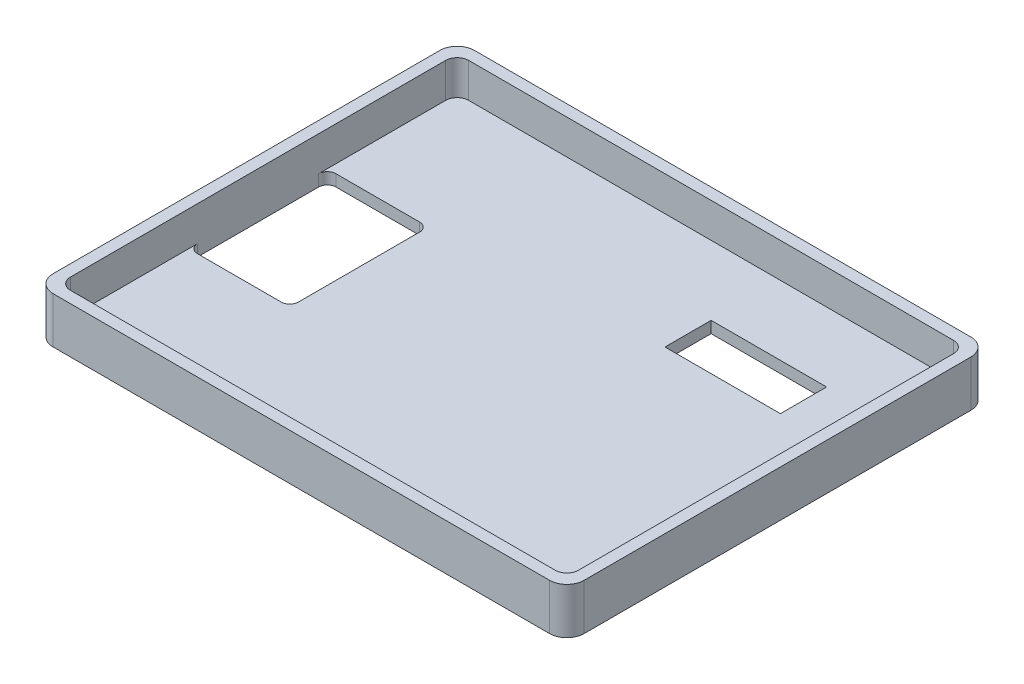
ISO-10303-21;
HEADER;
FILE_DESCRIPTION(('STEP AP214'),'2;1');
FILE_NAME('part.step','',(''),(''),'','','');
FILE_SCHEMA(('AUTOMOTIVE_DESIGN { 1 0 10303 214 1 1 1 1 }'));
ENDSEC;
DATA;
#1=APPLICATION_CONTEXT('core data for automotive mechanical design processes');
#2=APPLICATION_PROTOCOL_DEFINITION('international standard','automotive_design',2000,#1);
#3=PRODUCT_CONTEXT('',#1,'mechanical');
#4=PRODUCT('Part','Part','',(#3));
#5=PRODUCT_RELATED_PRODUCT_CATEGORY('part','',(#4));
#6=PRODUCT_DEFINITION_FORMATION('','',#4);
#7=PRODUCT_DEFINITION_CONTEXT('part definition',#1,'design');
#8=PRODUCT_DEFINITION('design','',#6,#7);
#9=PRODUCT_DEFINITION_SHAPE('','',#8);
#10=(LENGTH_UNIT() NAMED_UNIT(*) SI_UNIT(.MILLI.,.METRE.));
#11=(NAMED_UNIT(*) PLANE_ANGLE_UNIT() SI_UNIT($,.RADIAN.));
#12=(NAMED_UNIT(*) SI_UNIT($,.STERADIAN.) SOLID_ANGLE_UNIT());
#13=UNCERTAINTY_MEASURE_WITH_UNIT(LENGTH_MEASURE(1.E-05),#10,'distance_accuracy_value','');
#14=(GEOMETRIC_REPRESENTATION_CONTEXT(3) GLOBAL_UNCERTAINTY_ASSIGNED_CONTEXT((#13)) GLOBAL_UNIT_ASSIGNED_CONTEXT((#10,
#11,#12)) REPRESENTATION_CONTEXT('',''));
#15=CARTESIAN_POINT('',(0.,0.,0.));
#16=DIRECTION('',(0.,0.,1.));
#17=DIRECTION('',(1.,0.,0.));
#18=AXIS2_PLACEMENT_3D('',#15,#16,#17);
#19=CARTESIAN_POINT('',(0.,1.,-28.5));
#20=DIRECTION('',(0.,0.,-1.));
#21=DIRECTION('',(-1.,0.,0.));
#22=AXIS2_PLACEMENT_3D('',#19,#20,#21);
#23=PLANE('',#22);
#24=DIRECTION('',(1.,0.,0.));
#25=VECTOR('',#24,1.);
#26=CARTESIAN_POINT('',(0.,0.,-28.5));
#27=LINE('',#26,#25);
#28=CARTESIAN_POINT('',(28.,0.,-28.5));
#29=VERTEX_POINT('',#28);
#30=CARTESIAN_POINT('',(38.,0.,-28.5));
#31=VERTEX_POINT('',#30);
#32=EDGE_CURVE('E169',#29,#31,#27,.T.);
#33=ORIENTED_EDGE('',*,*,#32,.T.);
#34=DIRECTION('',(0.,-1.,0.));
#35=VECTOR('',#34,1.);
#36=CARTESIAN_POINT('',(38.,1.,-28.5));
#37=LINE('',#36,#35);
#38=CARTESIAN_POINT('',(38.,1.,-28.5));
#39=VERTEX_POINT('',#38);
#40=EDGE_CURVE('E11',#39,#31,#37,.T.);
#41=ORIENTED_EDGE('',*,*,#40,.F.);
#42=DIRECTION('',(1.,0.,0.));
#43=VECTOR('',#42,1.);
#44=CARTESIAN_POINT('',(0.,1.,-28.5));
#45=LINE('',#44,#43);
#46=CARTESIAN_POINT('',(28.,1.,-28.5));
#47=VERTEX_POINT('',#46);
#48=EDGE_CURVE('E133',#47,#39,#45,.T.);
#49=ORIENTED_EDGE('',*,*,#48,.F.);
#50=DIRECTION('',(0.,-1.,0.));
#51=VECTOR('',#50,1.);
#52=CARTESIAN_POINT('',(28.,1.,-28.5));
#53=LINE('',#52,#51);
#54=EDGE_CURVE('E54',#47,#29,#53,.T.);
#55=ORIENTED_EDGE('',*,*,#54,.T.);
#56=EDGE_LOOP('',(#33,#41,#49,#55));
#57=FACE_BOUND('',#56,.T.);
#58=ADVANCED_FACE('F35',(#57),#23,.F.);
#59=CARTESIAN_POINT('',(38.,1.,0.));
#60=DIRECTION('',(1.,0.,0.));
#61=DIRECTION('',(0.,0.,-1.));
#62=AXIS2_PLACEMENT_3D('',#59,#60,#61);
#63=PLANE('',#62);
#64=DIRECTION('',(0.,0.,1.));
#65=VECTOR('',#64,1.);
#66=CARTESIAN_POINT('',(38.,0.,0.));
#67=LINE('',#66,#65);
#68=CARTESIAN_POINT('',(38.,0.,-24.5));
#69=VERTEX_POINT('',#68);
#70=EDGE_CURVE('E139',#31,#69,#67,.T.);
#71=ORIENTED_EDGE('',*,*,#70,.T.);
#72=DIRECTION('',(0.,-1.,0.));
#73=VECTOR('',#72,1.);
#74=CARTESIAN_POINT('',(38.,1.,-24.5));
#75=LINE('',#74,#73);
#76=CARTESIAN_POINT('',(38.,1.,-24.5));
#77=VERTEX_POINT('',#76);
#78=EDGE_CURVE('E45',#77,#69,#75,.T.);
#79=ORIENTED_EDGE('',*,*,#78,.F.);
#80=DIRECTION('',(0.,0.,1.));
#81=VECTOR('',#80,1.);
#82=CARTESIAN_POINT('',(38.,1.,0.));
#83=LINE('',#82,#81);
#84=EDGE_CURVE('E127',#39,#77,#83,.T.);
#85=ORIENTED_EDGE('',*,*,#84,.F.);
#86=ORIENTED_EDGE('',*,*,#40,.T.);
#87=EDGE_LOOP('',(#71,#79,#85,#86));
#88=FACE_BOUND('',#87,.T.);
#89=ADVANCED_FACE('F138',(#88),#63,.F.);
#90=CARTESIAN_POINT('',(0.,1.,-24.5));
#91=DIRECTION('',(0.,0.,-1.));
#92=DIRECTION('',(-1.,0.,0.));
#93=AXIS2_PLACEMENT_3D('',#90,#91,#92);
#94=PLANE('',#93);
#95=DIRECTION('',(1.,0.,0.));
#96=VECTOR('',#95,1.);
#97=CARTESIAN_POINT('',(0.,0.,-24.5));
#98=LINE('',#97,#96);
#99=CARTESIAN_POINT('',(28.,0.,-24.5));
#100=VERTEX_POINT('',#99);
#101=EDGE_CURVE('E172',#100,#69,#98,.T.);
#102=ORIENTED_EDGE('',*,*,#101,.F.);
#103=DIRECTION('',(0.,-1.,0.));
#104=VECTOR('',#103,1.);
#105=CARTESIAN_POINT('',(28.,1.,-24.5));
#106=LINE('',#105,#104);
#107=CARTESIAN_POINT('',(28.,1.,-24.5));
#108=VERTEX_POINT('',#107);
#109=EDGE_CURVE('E90',#108,#100,#106,.T.);
#110=ORIENTED_EDGE('',*,*,#109,.F.);
#111=DIRECTION('',(1.,0.,0.));
#112=VECTOR('',#111,1.);
#113=CARTESIAN_POINT('',(0.,1.,-24.5));
#114=LINE('',#113,#112);
#115=EDGE_CURVE('E132',#108,#77,#114,.T.);
#116=ORIENTED_EDGE('',*,*,#115,.T.);
#117=ORIENTED_EDGE('',*,*,#78,.T.);
#118=EDGE_LOOP('',(#102,#110,#116,#117));
#119=FACE_BOUND('',#118,.T.);
#120=ADVANCED_FACE('F143',(#119),#94,.T.);
#121=CARTESIAN_POINT('',(0.75,1.,-22.5));
#122=DIRECTION('',(0.,-1.,0.));
#123=DIRECTION('',(0.,0.,-1.));
#124=AXIS2_PLACEMENT_3D('',#121,#122,#123);
#125=CYLINDRICAL_SURFACE('',#124,0.75);
#126=CARTESIAN_POINT('',(0.75,0.,-22.5));
#127=DIRECTION('',(0.,1.,0.));
#128=DIRECTION('',(0.,0.,1.));
#129=AXIS2_PLACEMENT_3D('',#126,#127,#128);
#130=CIRCLE('',#129,0.75);
#131=CARTESIAN_POINT('',(0.750000000000005,0.,-23.25));
#132=VERTEX_POINT('',#131);
#133=CARTESIAN_POINT('',(0.,0.,-22.5));
#134=VERTEX_POINT('',#133);
#135=EDGE_CURVE('E150',#132,#134,#130,.T.);
#136=ORIENTED_EDGE('',*,*,#135,.F.);
#137=DIRECTION('',(0.,-1.,0.));
#138=VECTOR('',#137,1.);
#139=CARTESIAN_POINT('',(0.750000000000005,1.,-23.25));
#140=LINE('',#139,#138);
#141=CARTESIAN_POINT('',(0.750000000000005,1.,-23.25));
#142=VERTEX_POINT('',#141);
#143=EDGE_CURVE('E102',#142,#132,#140,.T.);
#144=ORIENTED_EDGE('',*,*,#143,.F.);
#145=CARTESIAN_POINT('',(0.75,1.,-22.5));
#146=DIRECTION('',(0.,1.,0.));
#147=DIRECTION('',(0.,0.,1.));
#148=AXIS2_PLACEMENT_3D('',#145,#146,#147);
#149=CIRCLE('',#148,0.75);
#150=CARTESIAN_POINT('',(0.,1.,-22.5));
#151=VERTEX_POINT('',#150);
#152=EDGE_CURVE('E201',#142,#151,#149,.T.);
#153=ORIENTED_EDGE('',*,*,#152,.T.);
#154=DIRECTION('',(0.,-1.,0.));
#155=VECTOR('',#154,1.);
#156=CARTESIAN_POINT('',(0.,1.,-22.5));
#157=LINE('',#156,#155);
#158=EDGE_CURVE('E39',#151,#134,#157,.T.);
#159=ORIENTED_EDGE('',*,*,#158,.T.);
#160=EDGE_LOOP('',(#136,#144,#153,#159));
#161=FACE_BOUND('',#160,.T.);
#162=ADVANCED_FACE('F37',(#161),#125,.F.);
#163=CARTESIAN_POINT('',(0.,1.,-23.25));
#164=DIRECTION('',(0.,0.,1.));
#165=DIRECTION('',(1.,0.,0.));
#166=AXIS2_PLACEMENT_3D('',#163,#164,#165);
#167=PLANE('',#166);
#168=DIRECTION('',(-1.,0.,0.));
#169=VECTOR('',#168,1.);
#170=CARTESIAN_POINT('',(0.,0.,-23.25));
#171=LINE('',#170,#169);
#172=CARTESIAN_POINT('',(8.,0.,-23.25));
#173=VERTEX_POINT('',#172);
#174=EDGE_CURVE('E153',#173,#132,#171,.T.);
#175=ORIENTED_EDGE('',*,*,#174,.F.);
#176=DIRECTION('',(0.,-1.,0.));
#177=VECTOR('',#176,1.);
#178=CARTESIAN_POINT('',(8.,1.,-23.25));
#179=LINE('',#178,#177);
#180=CARTESIAN_POINT('',(8.,1.,-23.25));
#181=VERTEX_POINT('',#180);
#182=EDGE_CURVE('E193',#181,#173,#179,.T.);
#183=ORIENTED_EDGE('',*,*,#182,.F.);
#184=DIRECTION('',(-1.,0.,0.));
#185=VECTOR('',#184,1.);
#186=CARTESIAN_POINT('',(0.,1.,-23.25));
#187=LINE('',#186,#185);
#188=EDGE_CURVE('E218',#181,#142,#187,.T.);
#189=ORIENTED_EDGE('',*,*,#188,.T.);
#190=ORIENTED_EDGE('',*,*,#143,.T.);
#191=EDGE_LOOP('',(#175,#183,#189,#190));
#192=FACE_BOUND('',#191,.T.);
#193=ADVANCED_FACE('F215',(#192),#167,.T.);
#194=CARTESIAN_POINT('',(8.,1.,-22.5));
#195=DIRECTION('',(0.,-1.,0.));
#196=DIRECTION('',(0.,0.,-1.));
#197=AXIS2_PLACEMENT_3D('',#194,#195,#196);
#198=CYLINDRICAL_SURFACE('',#197,0.75);
#199=CARTESIAN_POINT('',(8.,0.,-22.5));
#200=DIRECTION('',(0.,1.,0.));
#201=DIRECTION('',(0.,0.,1.));
#202=AXIS2_PLACEMENT_3D('',#199,#200,#201);
#203=CIRCLE('',#202,0.75);
#204=CARTESIAN_POINT('',(8.75,0.,-22.5));
#205=VERTEX_POINT('',#204);
#206=EDGE_CURVE('E157',#173,#205,#203,.F.);
#207=ORIENTED_EDGE('',*,*,#206,.T.);
#208=DIRECTION('',(0.,-1.,0.));
#209=VECTOR('',#208,1.);
#210=CARTESIAN_POINT('',(8.75,1.,-22.5));
#211=LINE('',#210,#209);
#212=CARTESIAN_POINT('',(8.75,1.,-22.5));
#213=VERTEX_POINT('',#212);
#214=EDGE_CURVE('E190',#213,#205,#211,.T.);
#215=ORIENTED_EDGE('',*,*,#214,.F.);
#216=CARTESIAN_POINT('',(8.,1.,-22.5));
#217=DIRECTION('',(0.,1.,0.));
#218=DIRECTION('',(0.,0.,1.));
#219=AXIS2_PLACEMENT_3D('',#216,#217,#218);
#220=CIRCLE('',#219,0.75);
#221=EDGE_CURVE('E221',#181,#213,#220,.F.);
#222=ORIENTED_EDGE('',*,*,#221,.F.);
#223=ORIENTED_EDGE('',*,*,#182,.T.);
#224=EDGE_LOOP('',(#207,#215,#222,#223));
#225=FACE_BOUND('',#224,.T.);
#226=ADVANCED_FACE('F222',(#225),#198,.F.);
#227=CARTESIAN_POINT('',(8.75,1.,0.));
#228=DIRECTION('',(1.,0.,0.));
#229=DIRECTION('',(0.,0.,-1.));
#230=AXIS2_PLACEMENT_3D('',#227,#228,#229);
#231=PLANE('',#230);
#232=DIRECTION('',(0.,0.,1.));
#233=VECTOR('',#232,1.);
#234=CARTESIAN_POINT('',(8.75,0.,0.));
#235=LINE('',#234,#233);
#236=CARTESIAN_POINT('',(8.75,0.,-12.));
#237=VERTEX_POINT('',#236);
#238=EDGE_CURVE('E159',#205,#237,#235,.T.);
#239=ORIENTED_EDGE('',*,*,#238,.T.);
#240=DIRECTION('',(0.,-1.,0.));
#241=VECTOR('',#240,1.);
#242=CARTESIAN_POINT('',(8.75,1.,-12.));
#243=LINE('',#242,#241);
#244=CARTESIAN_POINT('',(8.75,1.,-12.));
#245=VERTEX_POINT('',#244);
#246=EDGE_CURVE('E187',#245,#237,#243,.T.);
#247=ORIENTED_EDGE('',*,*,#246,.F.);
#248=DIRECTION('',(0.,0.,1.));
#249=VECTOR('',#248,1.);
#250=CARTESIAN_POINT('',(8.75,1.,0.));
#251=LINE('',#250,#249);
#252=EDGE_CURVE('E225',#213,#245,#251,.T.);
#253=ORIENTED_EDGE('',*,*,#252,.F.);
#254=ORIENTED_EDGE('',*,*,#214,.T.);
#255=EDGE_LOOP('',(#239,#247,#253,#254));
#256=FACE_BOUND('',#255,.T.);
#257=ADVANCED_FACE('F444',(#256),#231,.F.);
#258=CARTESIAN_POINT('',(8.,1.,-12.));
#259=DIRECTION('',(0.,-1.,0.));
#260=DIRECTION('',(0.,0.,-1.));
#261=AXIS2_PLACEMENT_3D('',#258,#259,#260);
#262=CYLINDRICAL_SURFACE('',#261,0.749999999999999);
#263=CARTESIAN_POINT('',(8.,0.,-12.));
#264=DIRECTION('',(0.,1.,0.));
#265=DIRECTION('',(0.,0.,1.));
#266=AXIS2_PLACEMENT_3D('',#263,#264,#265);
#267=CIRCLE('',#266,0.749999999999999);
#268=CARTESIAN_POINT('',(8.,0.,-11.25));
#269=VERTEX_POINT('',#268);
#270=EDGE_CURVE('E161',#237,#269,#267,.F.);
#271=ORIENTED_EDGE('',*,*,#270,.T.);
#272=DIRECTION('',(0.,-1.,0.));
#273=VECTOR('',#272,1.);
#274=CARTESIAN_POINT('',(8.,1.,-11.25));
#275=LINE('',#274,#273);
#276=CARTESIAN_POINT('',(8.,1.,-11.25));
#277=VERTEX_POINT('',#276);
#278=EDGE_CURVE('E184',#277,#269,#275,.T.);
#279=ORIENTED_EDGE('',*,*,#278,.F.);
#280=CARTESIAN_POINT('',(8.,1.,-12.));
#281=DIRECTION('',(0.,1.,0.));
#282=DIRECTION('',(0.,0.,1.));
#283=AXIS2_PLACEMENT_3D('',#280,#281,#282);
#284=CIRCLE('',#283,0.749999999999999);
#285=EDGE_CURVE('E232',#245,#277,#284,.F.);
#286=ORIENTED_EDGE('',*,*,#285,.F.);
#287=ORIENTED_EDGE('',*,*,#246,.T.);
#288=EDGE_LOOP('',(#271,#279,#286,#287));
#289=FACE_BOUND('',#288,.T.);
#290=ADVANCED_FACE('F441',(#289),#262,.F.);
#291=CARTESIAN_POINT('',(0.,1.,-11.25));
#292=DIRECTION('',(0.,0.,1.));
#293=DIRECTION('',(1.,0.,0.));
#294=AXIS2_PLACEMENT_3D('',#291,#292,#293);
#295=PLANE('',#294);
#296=DIRECTION('',(-1.,0.,0.));
#297=VECTOR('',#296,1.);
#298=CARTESIAN_POINT('',(0.,0.,-11.25));
#299=LINE('',#298,#297);
#300=CARTESIAN_POINT('',(0.750000000000005,0.,-11.25));
#301=VERTEX_POINT('',#300);
#302=EDGE_CURVE('E163',#269,#301,#299,.T.);
#303=ORIENTED_EDGE('',*,*,#302,.T.);
#304=DIRECTION('',(0.,-1.,0.));
#305=VECTOR('',#304,1.);
#306=CARTESIAN_POINT('',(0.750000000000005,1.,-11.25));
#307=LINE('',#306,#305);
#308=CARTESIAN_POINT('',(0.750000000000005,1.,-11.25));
#309=VERTEX_POINT('',#308);
#310=EDGE_CURVE('E182',#309,#301,#307,.T.);
#311=ORIENTED_EDGE('',*,*,#310,.F.);
#312=DIRECTION('',(-1.,0.,0.));
#313=VECTOR('',#312,1.);
#314=CARTESIAN_POINT('',(0.,1.,-11.25));
#315=LINE('',#314,#313);
#316=EDGE_CURVE('E234',#277,#309,#315,.T.);
#317=ORIENTED_EDGE('',*,*,#316,.F.);
#318=ORIENTED_EDGE('',*,*,#278,.T.);
#319=EDGE_LOOP('',(#303,#311,#317,#318));
#320=FACE_BOUND('',#319,.T.);
#321=ADVANCED_FACE('F437',(#320),#295,.F.);
#322=CARTESIAN_POINT('',(0.75,1.,-12.));
#323=DIRECTION('',(0.,-1.,0.));
#324=DIRECTION('',(0.,0.,-1.));
#325=AXIS2_PLACEMENT_3D('',#322,#323,#324);
#326=CYLINDRICAL_SURFACE('',#325,0.75);
#327=CARTESIAN_POINT('',(0.75,0.,-12.));
#328=DIRECTION('',(0.,1.,0.));
#329=DIRECTION('',(0.,0.,1.));
#330=AXIS2_PLACEMENT_3D('',#327,#328,#329);
#331=CIRCLE('',#330,0.75);
#332=CARTESIAN_POINT('',(0.,0.,-12.));
#333=VERTEX_POINT('',#332);
#334=EDGE_CURVE('E166',#333,#301,#331,.T.);
#335=ORIENTED_EDGE('',*,*,#334,.F.);
#336=DIRECTION('',(0.,-1.,0.));
#337=VECTOR('',#336,1.);
#338=CARTESIAN_POINT('',(0.,1.,-12.));
#339=LINE('',#338,#337);
#340=CARTESIAN_POINT('',(0.,1.,-12.));
#341=VERTEX_POINT('',#340);
#342=EDGE_CURVE('E146',#341,#333,#339,.T.);
#343=ORIENTED_EDGE('',*,*,#342,.F.);
#344=CARTESIAN_POINT('',(0.75,1.,-12.));
#345=DIRECTION('',(0.,1.,0.));
#346=DIRECTION('',(0.,0.,1.));
#347=AXIS2_PLACEMENT_3D('',#344,#345,#346);
#348=CIRCLE('',#347,0.75);
#349=EDGE_CURVE('E236',#341,#309,#348,.T.);
#350=ORIENTED_EDGE('',*,*,#349,.T.);
#351=ORIENTED_EDGE('',*,*,#310,.T.);
#352=EDGE_LOOP('',(#335,#343,#350,#351));
#353=FACE_BOUND('',#352,.T.);
#354=ADVANCED_FACE('F433',(#353),#326,.F.);
#355=CARTESIAN_POINT('',(28.,1.,0.));
#356=DIRECTION('',(1.,0.,0.));
#357=DIRECTION('',(0.,0.,-1.));
#358=AXIS2_PLACEMENT_3D('',#355,#356,#357);
#359=PLANE('',#358);
#360=DIRECTION('',(0.,0.,1.));
#361=VECTOR('',#360,1.);
#362=CARTESIAN_POINT('',(28.,0.,0.));
#363=LINE('',#362,#361);
#364=EDGE_CURVE('E174',#29,#100,#363,.T.);
#365=ORIENTED_EDGE('',*,*,#364,.F.);
#366=ORIENTED_EDGE('',*,*,#54,.F.);
#367=DIRECTION('',(0.,0.,1.));
#368=VECTOR('',#367,1.);
#369=CARTESIAN_POINT('',(28.,1.,0.));
#370=LINE('',#369,#368);
#371=EDGE_CURVE('E144',#47,#108,#370,.T.);
#372=ORIENTED_EDGE('',*,*,#371,.T.);
#373=ORIENTED_EDGE('',*,*,#109,.T.);
#374=EDGE_LOOP('',(#365,#366,#372,#373));
#375=FACE_BOUND('',#374,.T.);
#376=ADVANCED_FACE('F463',(#375),#359,.T.);
#377=CARTESIAN_POINT('',(0.,1.,0.));
#378=DIRECTION('',(0.,1.,0.));
#379=DIRECTION('',(0.,0.,1.));
#380=AXIS2_PLACEMENT_3D('',#377,#378,#379);
#381=PLANE('',#380);
#382=DIRECTION('',(0.,0.,-1.));
#383=VECTOR('',#382,1.);
#384=CARTESIAN_POINT('',(0.,1.,0.));
#385=LINE('',#384,#383);
#386=CARTESIAN_POINT('',(0.,1.,-33.5));
#387=VERTEX_POINT('',#386);
#388=EDGE_CURVE('E177',#151,#387,#385,.T.);
#389=ORIENTED_EDGE('',*,*,#388,.F.);
#390=ORIENTED_EDGE('',*,*,#152,.F.);
#391=ORIENTED_EDGE('',*,*,#188,.F.);
#392=ORIENTED_EDGE('',*,*,#221,.T.);
#393=ORIENTED_EDGE('',*,*,#252,.T.);
#394=ORIENTED_EDGE('',*,*,#285,.T.);
#395=ORIENTED_EDGE('',*,*,#316,.T.);
#396=ORIENTED_EDGE('',*,*,#349,.F.);
#397=DIRECTION('',(0.,0.,-1.));
#398=VECTOR('',#397,1.);
#399=CARTESIAN_POINT('',(0.,1.,0.));
#400=LINE('',#399,#398);
#401=CARTESIAN_POINT('',(0.,1.,-1.00000000000001));
#402=VERTEX_POINT('',#401);
#403=EDGE_CURVE('E239',#402,#341,#400,.T.);
#404=ORIENTED_EDGE('',*,*,#403,.F.);
#405=CARTESIAN_POINT('',(1.,1.,-1.));
#406=DIRECTION('',(0.,1.,0.));
#407=DIRECTION('',(0.,0.,1.));
#408=AXIS2_PLACEMENT_3D('',#405,#406,#407);
#409=CIRCLE('',#408,1.);
#410=CARTESIAN_POINT('',(1.00000000000001,1.,0.));
#411=VERTEX_POINT('',#410);
#412=EDGE_CURVE('E242',#402,#411,#409,.T.);
#413=ORIENTED_EDGE('',*,*,#412,.T.);
#414=DIRECTION('',(1.,0.,0.));
#415=VECTOR('',#414,1.);
#416=CARTESIAN_POINT('',(0.,1.,0.));
#417=LINE('',#416,#415);
#418=CARTESIAN_POINT('',(43.,1.,0.));
#419=VERTEX_POINT('',#418);
#420=EDGE_CURVE('E245',#411,#419,#417,.T.);
#421=ORIENTED_EDGE('',*,*,#420,.T.);
#422=CARTESIAN_POINT('',(43.,1.,-1.));
#423=DIRECTION('',(0.,1.,0.));
#424=DIRECTION('',(0.,0.,1.));
#425=AXIS2_PLACEMENT_3D('',#422,#423,#424);
#426=CIRCLE('',#425,1.);
#427=CARTESIAN_POINT('',(44.,1.,-1.));
#428=VERTEX_POINT('',#427);
#429=EDGE_CURVE('E248',#419,#428,#426,.T.);
#430=ORIENTED_EDGE('',*,*,#429,.T.);
#431=DIRECTION('',(0.,0.,-1.));
#432=VECTOR('',#431,1.);
#433=CARTESIAN_POINT('',(44.,1.,0.));
#434=LINE('',#433,#432);
#435=CARTESIAN_POINT('',(44.,1.,-33.5));
#436=VERTEX_POINT('',#435);
#437=EDGE_CURVE('E251',#428,#436,#434,.T.);
#438=ORIENTED_EDGE('',*,*,#437,.T.);
#439=CARTESIAN_POINT('',(43.,1.,-33.5));
#440=DIRECTION('',(0.,1.,0.));
#441=DIRECTION('',(0.,0.,1.));
#442=AXIS2_PLACEMENT_3D('',#439,#440,#441);
#443=CIRCLE('',#442,1.);
#444=CARTESIAN_POINT('',(43.,1.,-34.5));
#445=VERTEX_POINT('',#444);
#446=EDGE_CURVE('E254',#436,#445,#443,.T.);
#447=ORIENTED_EDGE('',*,*,#446,.T.);
#448=DIRECTION('',(1.,0.,0.));
#449=VECTOR('',#448,1.);
#450=CARTESIAN_POINT('',(0.,1.,-34.5));
#451=LINE('',#450,#449);
#452=CARTESIAN_POINT('',(1.00000000000001,1.,-34.5));
#453=VERTEX_POINT('',#452);
#454=EDGE_CURVE('E257',#453,#445,#451,.T.);
#455=ORIENTED_EDGE('',*,*,#454,.F.);
#456=CARTESIAN_POINT('',(1.,1.,-33.5));
#457=DIRECTION('',(0.,1.,0.));
#458=DIRECTION('',(0.,0.,1.));
#459=AXIS2_PLACEMENT_3D('',#456,#457,#458);
#460=CIRCLE('',#459,1.);
#461=EDGE_CURVE('E260',#453,#387,#460,.T.);
#462=ORIENTED_EDGE('',*,*,#461,.T.);
#463=EDGE_LOOP('',(#389,#390,#391,#392,#393,#394,#395,#396,#404,#413,#421,#430,#438,#447,#455,#462));
#464=FACE_BOUND('',#463,.T.);
#465=ORIENTED_EDGE('',*,*,#48,.T.);
#466=ORIENTED_EDGE('',*,*,#84,.T.);
#467=ORIENTED_EDGE('',*,*,#115,.F.);
#468=ORIENTED_EDGE('',*,*,#371,.F.);
#469=EDGE_LOOP('',(#465,#466,#467,#468));
#470=FACE_BOUND('',#469,.T.);
#471=ADVANCED_FACE('F129',(#464,#470),#381,.T.);
#472=CARTESIAN_POINT('',(0.,0.,0.));
#473=DIRECTION('',(0.,1.,0.));
#474=DIRECTION('',(0.,0.,1.));
#475=AXIS2_PLACEMENT_3D('',#472,#473,#474);
#476=PLANE('',#475);
#477=ORIENTED_EDGE('',*,*,#135,.T.);
#478=DIRECTION('',(0.,0.,-1.));
#479=VECTOR('',#478,1.);
#480=CARTESIAN_POINT('',(0.,0.,0.));
#481=LINE('',#480,#479);
#482=EDGE_CURVE('E212',#333,#134,#481,.T.);
#483=ORIENTED_EDGE('',*,*,#482,.F.);
#484=ORIENTED_EDGE('',*,*,#334,.T.);
#485=ORIENTED_EDGE('',*,*,#302,.F.);
#486=ORIENTED_EDGE('',*,*,#270,.F.);
#487=ORIENTED_EDGE('',*,*,#238,.F.);
#488=ORIENTED_EDGE('',*,*,#206,.F.);
#489=ORIENTED_EDGE('',*,*,#174,.T.);
#490=EDGE_LOOP('',(#477,#483,#484,#485,#486,#487,#488,#489));
#491=FACE_BOUND('',#490,.T.);
#492=ORIENTED_EDGE('',*,*,#32,.F.);
#493=ORIENTED_EDGE('',*,*,#364,.T.);
#494=ORIENTED_EDGE('',*,*,#101,.T.);
#495=ORIENTED_EDGE('',*,*,#70,.F.);
#496=EDGE_LOOP('',(#492,#493,#494,#495));
#497=FACE_BOUND('',#496,.T.);
#498=CARTESIAN_POINT('',(43.5,0.,-34.));
#499=DIRECTION('',(0.,1.,0.));
#500=DIRECTION('',(0.,0.,1.));
#501=AXIS2_PLACEMENT_3D('',#498,#499,#500);
#502=CIRCLE('',#501,1.5);
#503=CARTESIAN_POINT('',(43.5,0.,-35.5));
#504=VERTEX_POINT('',#503);
#505=CARTESIAN_POINT('',(45.,0.,-34.));
#506=VERTEX_POINT('',#505);
#507=EDGE_CURVE('E349',#504,#506,#502,.F.);
#508=ORIENTED_EDGE('',*,*,#507,.T.);
#509=DIRECTION('',(0.,0.,-1.));
#510=VECTOR('',#509,1.);
#511=CARTESIAN_POINT('',(45.,0.,0.));
#512=LINE('',#511,#510);
#513=CARTESIAN_POINT('',(45.,0.,-0.500000000000011));
#514=VERTEX_POINT('',#513);
#515=EDGE_CURVE('E370',#514,#506,#512,.T.);
#516=ORIENTED_EDGE('',*,*,#515,.F.);
#517=CARTESIAN_POINT('',(43.5,0.,-0.5));
#518=DIRECTION('',(0.,1.,0.));
#519=DIRECTION('',(0.,0.,1.));
#520=AXIS2_PLACEMENT_3D('',#517,#518,#519);
#521=CIRCLE('',#520,1.5);
#522=CARTESIAN_POINT('',(43.5,0.,1.));
#523=VERTEX_POINT('',#522);
#524=EDGE_CURVE('E367',#523,#514,#521,.T.);
#525=ORIENTED_EDGE('',*,*,#524,.F.);
#526=DIRECTION('',(1.,0.,0.));
#527=VECTOR('',#526,1.);
#528=CARTESIAN_POINT('',(0.,0.,1.));
#529=LINE('',#528,#527);
#530=CARTESIAN_POINT('',(0.500000000000011,0.,1.));
#531=VERTEX_POINT('',#530);
#532=EDGE_CURVE('E364',#531,#523,#529,.T.);
#533=ORIENTED_EDGE('',*,*,#532,.F.);
#534=CARTESIAN_POINT('',(0.5,0.,-0.5));
#535=DIRECTION('',(0.,1.,0.));
#536=DIRECTION('',(0.,0.,1.));
#537=AXIS2_PLACEMENT_3D('',#534,#535,#536);
#538=CIRCLE('',#537,1.5);
#539=CARTESIAN_POINT('',(-1.,0.,-0.500000000000011));
#540=VERTEX_POINT('',#539);
#541=EDGE_CURVE('E361',#531,#540,#538,.F.);
#542=ORIENTED_EDGE('',*,*,#541,.T.);
#543=DIRECTION('',(0.,0.,-1.));
#544=VECTOR('',#543,1.);
#545=CARTESIAN_POINT('',(-1.,0.,0.));
#546=LINE('',#545,#544);
#547=CARTESIAN_POINT('',(-1.,0.,-34.));
#548=VERTEX_POINT('',#547);
#549=EDGE_CURVE('E358',#540,#548,#546,.T.);
#550=ORIENTED_EDGE('',*,*,#549,.T.);
#551=CARTESIAN_POINT('',(0.5,0.,-34.));
#552=DIRECTION('',(0.,1.,0.));
#553=DIRECTION('',(0.,0.,1.));
#554=AXIS2_PLACEMENT_3D('',#551,#552,#553);
#555=CIRCLE('',#554,1.5);
#556=CARTESIAN_POINT('',(0.500000000000011,0.,-35.5));
#557=VERTEX_POINT('',#556);
#558=EDGE_CURVE('E355',#548,#557,#555,.F.);
#559=ORIENTED_EDGE('',*,*,#558,.T.);
#560=DIRECTION('',(1.,0.,0.));
#561=VECTOR('',#560,1.);
#562=CARTESIAN_POINT('',(0.,0.,-35.5));
#563=LINE('',#562,#561);
#564=EDGE_CURVE('E352',#557,#504,#563,.T.);
#565=ORIENTED_EDGE('',*,*,#564,.T.);
#566=EDGE_LOOP('',(#508,#516,#525,#533,#542,#550,#559,#565));
#567=FACE_BOUND('',#566,.T.);
#568=ADVANCED_FACE('F210',(#491,#497,#567),#476,.F.);
#569=CARTESIAN_POINT('',(0.,4.,0.));
#570=DIRECTION('',(-1.,0.,0.));
#571=DIRECTION('',(0.,0.,1.));
#572=AXIS2_PLACEMENT_3D('',#569,#570,#571);
#573=PLANE('',#572);
#574=ORIENTED_EDGE('',*,*,#158,.F.);
#575=ORIENTED_EDGE('',*,*,#388,.T.);
#576=DIRECTION('',(0.,-1.,0.));
#577=VECTOR('',#576,1.);
#578=CARTESIAN_POINT('',(0.,4.,-33.5));
#579=LINE('',#578,#577);
#580=CARTESIAN_POINT('',(0.,4.,-33.5));
#581=VERTEX_POINT('',#580);
#582=EDGE_CURVE('E275',#581,#387,#579,.T.);
#583=ORIENTED_EDGE('',*,*,#582,.F.);
#584=DIRECTION('',(0.,0.,-1.));
#585=VECTOR('',#584,1.);
#586=CARTESIAN_POINT('',(0.,4.,0.));
#587=LINE('',#586,#585);
#588=CARTESIAN_POINT('',(0.,4.,-1.00000000000001));
#589=VERTEX_POINT('',#588);
#590=EDGE_CURVE('E294',#589,#581,#587,.T.);
#591=ORIENTED_EDGE('',*,*,#590,.F.);
#592=DIRECTION('',(0.,-1.,0.));
#593=VECTOR('',#592,1.);
#594=CARTESIAN_POINT('',(0.,4.,-1.00000000000001));
#595=LINE('',#594,#593);
#596=EDGE_CURVE('E321',#589,#402,#595,.T.);
#597=ORIENTED_EDGE('',*,*,#596,.T.);
#598=ORIENTED_EDGE('',*,*,#403,.T.);
#599=ORIENTED_EDGE('',*,*,#342,.T.);
#600=ORIENTED_EDGE('',*,*,#482,.T.);
#601=EDGE_LOOP('',(#574,#575,#583,#591,#597,#598,#599,#600));
#602=FACE_BOUND('',#601,.T.);
#603=ADVANCED_FACE('F314',(#602),#573,.F.);
#604=CARTESIAN_POINT('',(1.,4.,-33.5));
#605=DIRECTION('',(0.,-1.,0.));
#606=DIRECTION('',(0.,0.,-1.));
#607=AXIS2_PLACEMENT_3D('',#604,#605,#606);
#608=CYLINDRICAL_SURFACE('',#607,1.);
#609=ORIENTED_EDGE('',*,*,#582,.T.);
#610=ORIENTED_EDGE('',*,*,#461,.F.);
#611=DIRECTION('',(0.,-1.,0.));
#612=VECTOR('',#611,1.);
#613=CARTESIAN_POINT('',(1.00000000000001,4.,-34.5));
#614=LINE('',#613,#612);
#615=CARTESIAN_POINT('',(1.00000000000001,4.,-34.5));
#616=VERTEX_POINT('',#615);
#617=EDGE_CURVE('E154',#616,#453,#614,.T.);
#618=ORIENTED_EDGE('',*,*,#617,.F.);
#619=CARTESIAN_POINT('',(1.,4.,-33.5));
#620=DIRECTION('',(0.,1.,0.));
#621=DIRECTION('',(0.,0.,1.));
#622=AXIS2_PLACEMENT_3D('',#619,#620,#621);
#623=CIRCLE('',#622,1.);
#624=EDGE_CURVE('E323',#616,#581,#623,.T.);
#625=ORIENTED_EDGE('',*,*,#624,.T.);
#626=EDGE_LOOP('',(#609,#610,#618,#625));
#627=FACE_BOUND('',#626,.T.);
#628=ADVANCED_FACE('F270',(#627),#608,.F.);
#629=CARTESIAN_POINT('',(0.,4.,-34.5));
#630=DIRECTION('',(0.,0.,-1.));
#631=DIRECTION('',(-1.,0.,0.));
#632=AXIS2_PLACEMENT_3D('',#629,#630,#631);
#633=PLANE('',#632);
#634=ORIENTED_EDGE('',*,*,#454,.T.);
#635=DIRECTION('',(0.,-1.,0.));
#636=VECTOR('',#635,1.);
#637=CARTESIAN_POINT('',(43.,4.,-34.5));
#638=LINE('',#637,#636);
#639=CARTESIAN_POINT('',(43.,4.,-34.5));
#640=VERTEX_POINT('',#639);
#641=EDGE_CURVE('E284',#640,#445,#638,.T.);
#642=ORIENTED_EDGE('',*,*,#641,.F.);
#643=DIRECTION('',(1.,0.,0.));
#644=VECTOR('',#643,1.);
#645=CARTESIAN_POINT('',(0.,4.,-34.5));
#646=LINE('',#645,#644);
#647=EDGE_CURVE('E282',#616,#640,#646,.T.);
#648=ORIENTED_EDGE('',*,*,#647,.F.);
#649=ORIENTED_EDGE('',*,*,#617,.T.);
#650=EDGE_LOOP('',(#634,#642,#648,#649));
#651=FACE_BOUND('',#650,.T.);
#652=ADVANCED_FACE('F278',(#651),#633,.F.);
#653=CARTESIAN_POINT('',(43.,4.,-33.5));
#654=DIRECTION('',(0.,-1.,0.));
#655=DIRECTION('',(0.,0.,-1.));
#656=AXIS2_PLACEMENT_3D('',#653,#654,#655);
#657=CYLINDRICAL_SURFACE('',#656,1.);
#658=ORIENTED_EDGE('',*,*,#641,.T.);
#659=ORIENTED_EDGE('',*,*,#446,.F.);
#660=DIRECTION('',(0.,-1.,0.));
#661=VECTOR('',#660,1.);
#662=CARTESIAN_POINT('',(44.,4.,-33.5));
#663=LINE('',#662,#661);
#664=CARTESIAN_POINT('',(44.,4.,-33.5));
#665=VERTEX_POINT('',#664);
#666=EDGE_CURVE('E286',#665,#436,#663,.T.);
#667=ORIENTED_EDGE('',*,*,#666,.F.);
#668=CARTESIAN_POINT('',(43.,4.,-33.5));
#669=DIRECTION('',(0.,1.,0.));
#670=DIRECTION('',(0.,0.,1.));
#671=AXIS2_PLACEMENT_3D('',#668,#669,#670);
#672=CIRCLE('',#671,1.);
#673=EDGE_CURVE('E327',#665,#640,#672,.T.);
#674=ORIENTED_EDGE('',*,*,#673,.T.);
#675=EDGE_LOOP('',(#658,#659,#667,#674));
#676=FACE_BOUND('',#675,.T.);
#677=ADVANCED_FACE('F510',(#676),#657,.F.);
#678=CARTESIAN_POINT('',(44.,4.,0.));
#679=DIRECTION('',(-1.,0.,0.));
#680=DIRECTION('',(0.,0.,1.));
#681=AXIS2_PLACEMENT_3D('',#678,#679,#680);
#682=PLANE('',#681);
#683=ORIENTED_EDGE('',*,*,#666,.T.);
#684=ORIENTED_EDGE('',*,*,#437,.F.);
#685=DIRECTION('',(0.,-1.,0.));
#686=VECTOR('',#685,1.);
#687=CARTESIAN_POINT('',(44.,4.,-1.));
#688=LINE('',#687,#686);
#689=CARTESIAN_POINT('',(44.,4.,-1.));
#690=VERTEX_POINT('',#689);
#691=EDGE_CURVE('E382',#690,#428,#688,.T.);
#692=ORIENTED_EDGE('',*,*,#691,.F.);
#693=DIRECTION('',(0.,0.,-1.));
#694=VECTOR('',#693,1.);
#695=CARTESIAN_POINT('',(44.,4.,0.));
#696=LINE('',#695,#694);
#697=EDGE_CURVE('E336',#690,#665,#696,.T.);
#698=ORIENTED_EDGE('',*,*,#697,.T.);
#699=EDGE_LOOP('',(#683,#684,#692,#698));
#700=FACE_BOUND('',#699,.T.);
#701=ADVANCED_FACE('F389',(#700),#682,.T.);
#702=CARTESIAN_POINT('',(43.,4.,-1.));
#703=DIRECTION('',(0.,-1.,0.));
#704=DIRECTION('',(0.,0.,-1.));
#705=AXIS2_PLACEMENT_3D('',#702,#703,#704);
#706=CYLINDRICAL_SURFACE('',#705,1.);
#707=ORIENTED_EDGE('',*,*,#691,.T.);
#708=ORIENTED_EDGE('',*,*,#429,.F.);
#709=DIRECTION('',(0.,-1.,0.));
#710=VECTOR('',#709,1.);
#711=CARTESIAN_POINT('',(43.,4.,0.));
#712=LINE('',#711,#710);
#713=CARTESIAN_POINT('',(43.,4.,0.));
#714=VERTEX_POINT('',#713);
#715=EDGE_CURVE('E379',#714,#419,#712,.T.);
#716=ORIENTED_EDGE('',*,*,#715,.F.);
#717=CARTESIAN_POINT('',(43.,4.,-1.));
#718=DIRECTION('',(0.,1.,0.));
#719=DIRECTION('',(0.,0.,1.));
#720=AXIS2_PLACEMENT_3D('',#717,#718,#719);
#721=CIRCLE('',#720,1.);
#722=EDGE_CURVE('E339',#714,#690,#721,.T.);
#723=ORIENTED_EDGE('',*,*,#722,.T.);
#724=EDGE_LOOP('',(#707,#708,#716,#723));
#725=FACE_BOUND('',#724,.T.);
#726=ADVANCED_FACE('F404',(#725),#706,.F.);
#727=CARTESIAN_POINT('',(0.,4.,0.));
#728=DIRECTION('',(0.,0.,-1.));
#729=DIRECTION('',(-1.,0.,0.));
#730=AXIS2_PLACEMENT_3D('',#727,#728,#729);
#731=PLANE('',#730);
#732=ORIENTED_EDGE('',*,*,#715,.T.);
#733=ORIENTED_EDGE('',*,*,#420,.F.);
#734=DIRECTION('',(0.,-1.,0.));
#735=VECTOR('',#734,1.);
#736=CARTESIAN_POINT('',(1.00000000000001,4.,0.));
#737=LINE('',#736,#735);
#738=CARTESIAN_POINT('',(1.00000000000001,4.,0.));
#739=VERTEX_POINT('',#738);
#740=EDGE_CURVE('E376',#739,#411,#737,.T.);
#741=ORIENTED_EDGE('',*,*,#740,.F.);
#742=DIRECTION('',(1.,0.,0.));
#743=VECTOR('',#742,1.);
#744=CARTESIAN_POINT('',(0.,4.,0.));
#745=LINE('',#744,#743);
#746=EDGE_CURVE('E342',#739,#714,#745,.T.);
#747=ORIENTED_EDGE('',*,*,#746,.T.);
#748=EDGE_LOOP('',(#732,#733,#741,#747));
#749=FACE_BOUND('',#748,.T.);
#750=ADVANCED_FACE('F410',(#749),#731,.T.);
#751=CARTESIAN_POINT('',(1.,4.,-1.));
#752=DIRECTION('',(0.,-1.,0.));
#753=DIRECTION('',(0.,0.,-1.));
#754=AXIS2_PLACEMENT_3D('',#751,#752,#753);
#755=CYLINDRICAL_SURFACE('',#754,1.);
#756=ORIENTED_EDGE('',*,*,#740,.T.);
#757=ORIENTED_EDGE('',*,*,#412,.F.);
#758=ORIENTED_EDGE('',*,*,#596,.F.);
#759=CARTESIAN_POINT('',(1.,4.,-1.));
#760=DIRECTION('',(0.,1.,0.));
#761=DIRECTION('',(0.,0.,1.));
#762=AXIS2_PLACEMENT_3D('',#759,#760,#761);
#763=CIRCLE('',#762,1.);
#764=EDGE_CURVE('E345',#589,#739,#763,.T.);
#765=ORIENTED_EDGE('',*,*,#764,.T.);
#766=EDGE_LOOP('',(#756,#757,#758,#765));
#767=FACE_BOUND('',#766,.T.);
#768=ADVANCED_FACE('F420',(#767),#755,.F.);
#769=CARTESIAN_POINT('',(43.5,4.,-34.));
#770=DIRECTION('',(0.,-1.,0.));
#771=DIRECTION('',(0.,0.,-1.));
#772=AXIS2_PLACEMENT_3D('',#769,#770,#771);
#773=CYLINDRICAL_SURFACE('',#772,1.5);
#774=ORIENTED_EDGE('',*,*,#507,.F.);
#775=DIRECTION('',(0.,-1.,0.));
#776=VECTOR('',#775,1.);
#777=CARTESIAN_POINT('',(43.5,4.,-35.5));
#778=LINE('',#777,#776);
#779=CARTESIAN_POINT('',(43.5,4.,-35.5));
#780=VERTEX_POINT('',#779);
#781=EDGE_CURVE('E312',#780,#504,#778,.T.);
#782=ORIENTED_EDGE('',*,*,#781,.F.);
#783=CARTESIAN_POINT('',(43.5,4.,-34.));
#784=DIRECTION('',(0.,1.,0.));
#785=DIRECTION('',(0.,0.,1.));
#786=AXIS2_PLACEMENT_3D('',#783,#784,#785);
#787=CIRCLE('',#786,1.5);
#788=CARTESIAN_POINT('',(45.,4.,-34.));
#789=VERTEX_POINT('',#788);
#790=EDGE_CURVE('E373',#780,#789,#787,.F.);
#791=ORIENTED_EDGE('',*,*,#790,.T.);
#792=DIRECTION('',(0.,-1.,0.));
#793=VECTOR('',#792,1.);
#794=CARTESIAN_POINT('',(45.,4.,-34.));
#795=LINE('',#794,#793);
#796=EDGE_CURVE('E290',#789,#506,#795,.T.);
#797=ORIENTED_EDGE('',*,*,#796,.T.);
#798=EDGE_LOOP('',(#774,#782,#791,#797));
#799=FACE_BOUND('',#798,.T.);
#800=ADVANCED_FACE('F541',(#799),#773,.T.);
#801=CARTESIAN_POINT('',(0.,4.,-35.5));
#802=DIRECTION('',(0.,0.,-1.));
#803=DIRECTION('',(-1.,0.,0.));
#804=AXIS2_PLACEMENT_3D('',#801,#802,#803);
#805=PLANE('',#804);
#806=ORIENTED_EDGE('',*,*,#564,.F.);
#807=DIRECTION('',(0.,-1.,0.));
#808=VECTOR('',#807,1.);
#809=CARTESIAN_POINT('',(0.500000000000011,4.,-35.5));
#810=LINE('',#809,#808);
#811=CARTESIAN_POINT('',(0.500000000000011,4.,-35.5));
#812=VERTEX_POINT('',#811);
#813=EDGE_CURVE('E309',#812,#557,#810,.T.);
#814=ORIENTED_EDGE('',*,*,#813,.F.);
#815=DIRECTION('',(1.,0.,0.));
#816=VECTOR('',#815,1.);
#817=CARTESIAN_POINT('',(0.,4.,-35.5));
#818=LINE('',#817,#816);
#819=EDGE_CURVE('E742',#812,#780,#818,.T.);
#820=ORIENTED_EDGE('',*,*,#819,.T.);
#821=ORIENTED_EDGE('',*,*,#781,.T.);
#822=EDGE_LOOP('',(#806,#814,#820,#821));
#823=FACE_BOUND('',#822,.T.);
#824=ADVANCED_FACE('F548',(#823),#805,.T.);
#825=CARTESIAN_POINT('',(0.5,4.,-34.));
#826=DIRECTION('',(0.,-1.,0.));
#827=DIRECTION('',(0.,0.,-1.));
#828=AXIS2_PLACEMENT_3D('',#825,#826,#827);
#829=CYLINDRICAL_SURFACE('',#828,1.5);
#830=ORIENTED_EDGE('',*,*,#558,.F.);
#831=DIRECTION('',(0.,-1.,0.));
#832=VECTOR('',#831,1.);
#833=CARTESIAN_POINT('',(-1.,4.,-34.));
#834=LINE('',#833,#832);
#835=CARTESIAN_POINT('',(-1.,4.,-34.));
#836=VERTEX_POINT('',#835);
#837=EDGE_CURVE('E306',#836,#548,#834,.T.);
#838=ORIENTED_EDGE('',*,*,#837,.F.);
#839=CARTESIAN_POINT('',(0.5,4.,-34.));
#840=DIRECTION('',(0.,1.,0.));
#841=DIRECTION('',(0.,0.,1.));
#842=AXIS2_PLACEMENT_3D('',#839,#840,#841);
#843=CIRCLE('',#842,1.5);
#844=EDGE_CURVE('E756',#836,#812,#843,.F.);
#845=ORIENTED_EDGE('',*,*,#844,.T.);
#846=ORIENTED_EDGE('',*,*,#813,.T.);
#847=EDGE_LOOP('',(#830,#838,#845,#846));
#848=FACE_BOUND('',#847,.T.);
#849=ADVANCED_FACE('F556',(#848),#829,.T.);
#850=CARTESIAN_POINT('',(-1.,4.,0.));
#851=DIRECTION('',(-1.,0.,0.));
#852=DIRECTION('',(0.,0.,1.));
#853=AXIS2_PLACEMENT_3D('',#850,#851,#852);
#854=PLANE('',#853);
#855=ORIENTED_EDGE('',*,*,#549,.F.);
#856=DIRECTION('',(0.,-1.,0.));
#857=VECTOR('',#856,1.);
#858=CARTESIAN_POINT('',(-1.,4.,-0.500000000000011));
#859=LINE('',#858,#857);
#860=CARTESIAN_POINT('',(-1.,4.,-0.500000000000011));
#861=VERTEX_POINT('',#860);
#862=EDGE_CURVE('E303',#861,#540,#859,.T.);
#863=ORIENTED_EDGE('',*,*,#862,.F.);
#864=DIRECTION('',(0.,0.,-1.));
#865=VECTOR('',#864,1.);
#866=CARTESIAN_POINT('',(-1.,4.,0.));
#867=LINE('',#866,#865);
#868=EDGE_CURVE('E758',#861,#836,#867,.T.);
#869=ORIENTED_EDGE('',*,*,#868,.T.);
#870=ORIENTED_EDGE('',*,*,#837,.T.);
#871=EDGE_LOOP('',(#855,#863,#869,#870));
#872=FACE_BOUND('',#871,.T.);
#873=ADVANCED_FACE('F564',(#872),#854,.T.);
#874=CARTESIAN_POINT('',(0.5,4.,-0.5));
#875=DIRECTION('',(0.,-1.,0.));
#876=DIRECTION('',(0.,0.,-1.));
#877=AXIS2_PLACEMENT_3D('',#874,#875,#876);
#878=CYLINDRICAL_SURFACE('',#877,1.5);
#879=ORIENTED_EDGE('',*,*,#541,.F.);
#880=DIRECTION('',(0.,-1.,0.));
#881=VECTOR('',#880,1.);
#882=CARTESIAN_POINT('',(0.500000000000011,4.,1.));
#883=LINE('',#882,#881);
#884=CARTESIAN_POINT('',(0.500000000000011,4.,1.));
#885=VERTEX_POINT('',#884);
#886=EDGE_CURVE('E300',#885,#531,#883,.T.);
#887=ORIENTED_EDGE('',*,*,#886,.F.);
#888=CARTESIAN_POINT('',(0.5,4.,-0.5));
#889=DIRECTION('',(0.,1.,0.));
#890=DIRECTION('',(0.,0.,1.));
#891=AXIS2_PLACEMENT_3D('',#888,#889,#890);
#892=CIRCLE('',#891,1.5);
#893=EDGE_CURVE('E763',#885,#861,#892,.F.);
#894=ORIENTED_EDGE('',*,*,#893,.T.);
#895=ORIENTED_EDGE('',*,*,#862,.T.);
#896=EDGE_LOOP('',(#879,#887,#894,#895));
#897=FACE_BOUND('',#896,.T.);
#898=ADVANCED_FACE('F572',(#897),#878,.T.);
#899=CARTESIAN_POINT('',(0.,4.,1.));
#900=DIRECTION('',(0.,0.,-1.));
#901=DIRECTION('',(-1.,0.,0.));
#902=AXIS2_PLACEMENT_3D('',#899,#900,#901);
#903=PLANE('',#902);
#904=ORIENTED_EDGE('',*,*,#532,.T.);
#905=DIRECTION('',(0.,-1.,0.));
#906=VECTOR('',#905,1.);
#907=CARTESIAN_POINT('',(43.5,4.,1.));
#908=LINE('',#907,#906);
#909=CARTESIAN_POINT('',(43.5,4.,1.));
#910=VERTEX_POINT('',#909);
#911=EDGE_CURVE('E297',#910,#523,#908,.T.);
#912=ORIENTED_EDGE('',*,*,#911,.F.);
#913=DIRECTION('',(1.,0.,0.));
#914=VECTOR('',#913,1.);
#915=CARTESIAN_POINT('',(0.,4.,1.));
#916=LINE('',#915,#914);
#917=EDGE_CURVE('E766',#885,#910,#916,.T.);
#918=ORIENTED_EDGE('',*,*,#917,.F.);
#919=ORIENTED_EDGE('',*,*,#886,.T.);
#920=EDGE_LOOP('',(#904,#912,#918,#919));
#921=FACE_BOUND('',#920,.T.);
#922=ADVANCED_FACE('F580',(#921),#903,.F.);
#923=CARTESIAN_POINT('',(43.5,4.,-0.5));
#924=DIRECTION('',(0.,-1.,0.));
#925=DIRECTION('',(0.,0.,-1.));
#926=AXIS2_PLACEMENT_3D('',#923,#924,#925);
#927=CYLINDRICAL_SURFACE('',#926,1.5);
#928=ORIENTED_EDGE('',*,*,#524,.T.);
#929=DIRECTION('',(0.,-1.,0.));
#930=VECTOR('',#929,1.);
#931=CARTESIAN_POINT('',(45.,4.,-0.500000000000011));
#932=LINE('',#931,#930);
#933=CARTESIAN_POINT('',(45.,4.,-0.500000000000011));
#934=VERTEX_POINT('',#933);
#935=EDGE_CURVE('E293',#934,#514,#932,.T.);
#936=ORIENTED_EDGE('',*,*,#935,.F.);
#937=CARTESIAN_POINT('',(43.5,4.,-0.5));
#938=DIRECTION('',(0.,1.,0.));
#939=DIRECTION('',(0.,0.,1.));
#940=AXIS2_PLACEMENT_3D('',#937,#938,#939);
#941=CIRCLE('',#940,1.5);
#942=EDGE_CURVE('E330',#910,#934,#941,.T.);
#943=ORIENTED_EDGE('',*,*,#942,.F.);
#944=ORIENTED_EDGE('',*,*,#911,.T.);
#945=EDGE_LOOP('',(#928,#936,#943,#944));
#946=FACE_BOUND('',#945,.T.);
#947=ADVANCED_FACE('F588',(#946),#927,.T.);
#948=CARTESIAN_POINT('',(45.,4.,0.));
#949=DIRECTION('',(-1.,0.,0.));
#950=DIRECTION('',(0.,0.,1.));
#951=AXIS2_PLACEMENT_3D('',#948,#949,#950);
#952=PLANE('',#951);
#953=ORIENTED_EDGE('',*,*,#515,.T.);
#954=ORIENTED_EDGE('',*,*,#796,.F.);
#955=DIRECTION('',(0.,0.,-1.));
#956=VECTOR('',#955,1.);
#957=CARTESIAN_POINT('',(45.,4.,0.));
#958=LINE('',#957,#956);
#959=EDGE_CURVE('E325',#934,#789,#958,.T.);
#960=ORIENTED_EDGE('',*,*,#959,.F.);
#961=ORIENTED_EDGE('',*,*,#935,.T.);
#962=EDGE_LOOP('',(#953,#954,#960,#961));
#963=FACE_BOUND('',#962,.T.);
#964=ADVANCED_FACE('F596',(#963),#952,.F.);
#965=CARTESIAN_POINT('',(0.,4.,0.));
#966=DIRECTION('',(0.,1.,0.));
#967=DIRECTION('',(0.,0.,1.));
#968=AXIS2_PLACEMENT_3D('',#965,#966,#967);
#969=PLANE('',#968);
#970=ORIENTED_EDGE('',*,*,#790,.F.);
#971=ORIENTED_EDGE('',*,*,#819,.F.);
#972=ORIENTED_EDGE('',*,*,#844,.F.);
#973=ORIENTED_EDGE('',*,*,#868,.F.);
#974=ORIENTED_EDGE('',*,*,#893,.F.);
#975=ORIENTED_EDGE('',*,*,#917,.T.);
#976=ORIENTED_EDGE('',*,*,#942,.T.);
#977=ORIENTED_EDGE('',*,*,#959,.T.);
#978=EDGE_LOOP('',(#970,#971,#972,#973,#974,#975,#976,#977));
#979=FACE_BOUND('',#978,.T.);
#980=ORIENTED_EDGE('',*,*,#624,.F.);
#981=ORIENTED_EDGE('',*,*,#647,.T.);
#982=ORIENTED_EDGE('',*,*,#673,.F.);
#983=ORIENTED_EDGE('',*,*,#697,.F.);
#984=ORIENTED_EDGE('',*,*,#722,.F.);
#985=ORIENTED_EDGE('',*,*,#746,.F.);
#986=ORIENTED_EDGE('',*,*,#764,.F.);
#987=ORIENTED_EDGE('',*,*,#590,.T.);
#988=EDGE_LOOP('',(#980,#981,#982,#983,#984,#985,#986,#987));
#989=FACE_BOUND('',#988,.T.);
#990=ADVANCED_FACE('F416',(#979,#989),#969,.T.);
#991=CLOSED_SHELL('',(#58,#89,#120,#162,#193,#226,#257,#290,#321,#354,#376,#471,#568,#603,#628,
#652,#677,#701,#726,#750,#768,#800,#824,#849,#873,#898,#922,#947,#964,#990));
#992=MANIFOLD_SOLID_BREP('B2',#991);
#993=ADVANCED_BREP_SHAPE_REPRESENTATION('',(#18,#992),#14);
#994=SHAPE_DEFINITION_REPRESENTATION(#9,#993);
ENDSEC;
END-ISO-10303-21;
